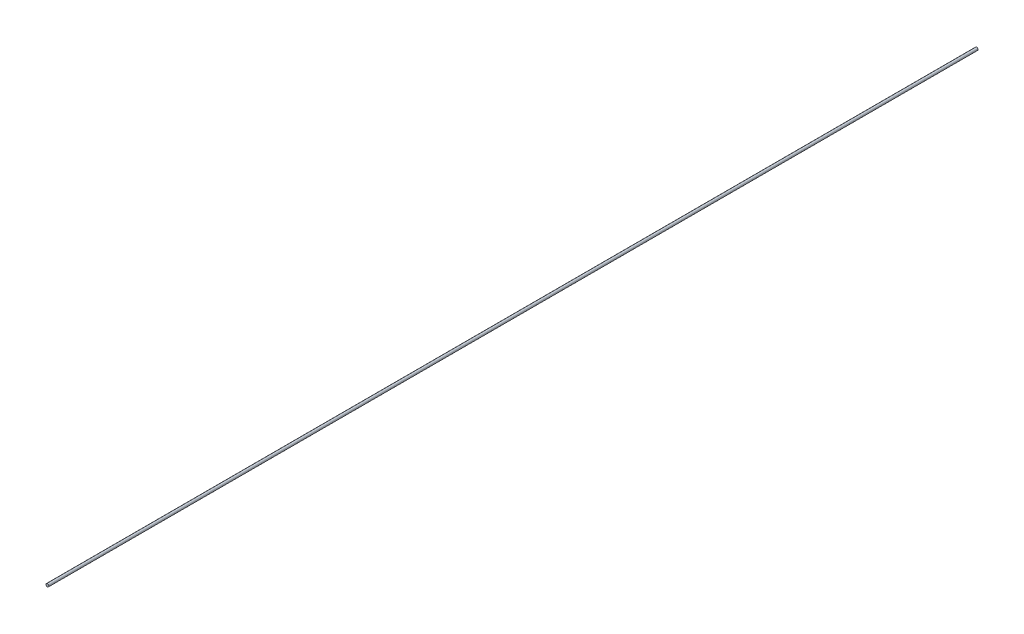
ISO-10303-21;
HEADER;
FILE_DESCRIPTION(('STEP AP214'),'2;1');
FILE_NAME('part.step','',(''),(''),'','','');
FILE_SCHEMA(('AUTOMOTIVE_DESIGN { 1 0 10303 214 1 1 1 1 }'));
ENDSEC;
DATA;
#1=APPLICATION_CONTEXT('core data for automotive mechanical design processes');
#2=APPLICATION_PROTOCOL_DEFINITION('international standard','automotive_design',2000,#1);
#3=PRODUCT_CONTEXT('',#1,'mechanical');
#4=PRODUCT('Part','Part','',(#3));
#5=PRODUCT_RELATED_PRODUCT_CATEGORY('part','',(#4));
#6=PRODUCT_DEFINITION_FORMATION('','',#4);
#7=PRODUCT_DEFINITION_CONTEXT('part definition',#1,'design');
#8=PRODUCT_DEFINITION('design','',#6,#7);
#9=PRODUCT_DEFINITION_SHAPE('','',#8);
#10=(LENGTH_UNIT() NAMED_UNIT(*) SI_UNIT(.MILLI.,.METRE.));
#11=(NAMED_UNIT(*) PLANE_ANGLE_UNIT() SI_UNIT($,.RADIAN.));
#12=(NAMED_UNIT(*) SI_UNIT($,.STERADIAN.) SOLID_ANGLE_UNIT());
#13=UNCERTAINTY_MEASURE_WITH_UNIT(LENGTH_MEASURE(1.E-05),#10,'distance_accuracy_value','');
#14=(GEOMETRIC_REPRESENTATION_CONTEXT(3) GLOBAL_UNCERTAINTY_ASSIGNED_CONTEXT((#13)) GLOBAL_UNIT_ASSIGNED_CONTEXT((#10,
#11,#12)) REPRESENTATION_CONTEXT('',''));
#15=CARTESIAN_POINT('',(0.,0.,0.));
#16=DIRECTION('',(0.,0.,1.));
#17=DIRECTION('',(1.,0.,0.));
#18=AXIS2_PLACEMENT_3D('',#15,#16,#17);
#19=CARTESIAN_POINT('',(0.,0.,1000.));
#20=DIRECTION('',(0.,0.,-1.));
#21=DIRECTION('',(-1.,0.,0.));
#22=AXIS2_PLACEMENT_3D('',#19,#20,#21);
#23=CYLINDRICAL_SURFACE('',#22,1.5);
#24=CARTESIAN_POINT('',(0.,0.,1000.));
#25=DIRECTION('',(0.,0.,1.));
#26=DIRECTION('',(1.,0.,0.));
#27=AXIS2_PLACEMENT_3D('',#24,#25,#26);
#28=CIRCLE('',#27,1.5);
#29=CARTESIAN_POINT('',(1.5,0.,1000.));
#30=VERTEX_POINT('',#29);
#31=EDGE_CURVE('E10',#30,#30,#28,.T.);
#32=ORIENTED_EDGE('',*,*,#31,.F.);
#33=EDGE_LOOP('',(#32));
#34=FACE_BOUND('',#33,.T.);
#35=CARTESIAN_POINT('',(0.,0.,0.));
#36=DIRECTION('',(0.,0.,1.));
#37=DIRECTION('',(1.,0.,0.));
#38=AXIS2_PLACEMENT_3D('',#35,#36,#37);
#39=CIRCLE('',#38,1.5);
#40=CARTESIAN_POINT('',(1.5,0.,0.));
#41=VERTEX_POINT('',#40);
#42=EDGE_CURVE('E38',#41,#41,#39,.T.);
#43=ORIENTED_EDGE('',*,*,#42,.T.);
#44=EDGE_LOOP('',(#43));
#45=FACE_BOUND('',#44,.T.);
#46=ADVANCED_FACE('F35',(#34,#45),#23,.T.);
#47=CARTESIAN_POINT('',(0.,0.,1000.));
#48=DIRECTION('',(0.,0.,1.));
#49=DIRECTION('',(1.,0.,0.));
#50=AXIS2_PLACEMENT_3D('',#47,#48,#49);
#51=PLANE('',#50);
#52=ORIENTED_EDGE('',*,*,#31,.T.);
#53=EDGE_LOOP('',(#52));
#54=FACE_BOUND('',#53,.T.);
#55=ADVANCED_FACE('F50',(#54),#51,.T.);
#56=CARTESIAN_POINT('',(0.,0.,0.));
#57=DIRECTION('',(0.,0.,1.));
#58=DIRECTION('',(1.,0.,0.));
#59=AXIS2_PLACEMENT_3D('',#56,#57,#58);
#60=PLANE('',#59);
#61=ORIENTED_EDGE('',*,*,#42,.F.);
#62=EDGE_LOOP('',(#61));
#63=FACE_BOUND('',#62,.T.);
#64=ADVANCED_FACE('F48',(#63),#60,.F.);
#65=CLOSED_SHELL('',(#46,#55,#64));
#66=MANIFOLD_SOLID_BREP('B2',#65);
#67=ADVANCED_BREP_SHAPE_REPRESENTATION('',(#18,#66),#14);
#68=SHAPE_DEFINITION_REPRESENTATION(#9,#67);
ENDSEC;
END-ISO-10303-21;
